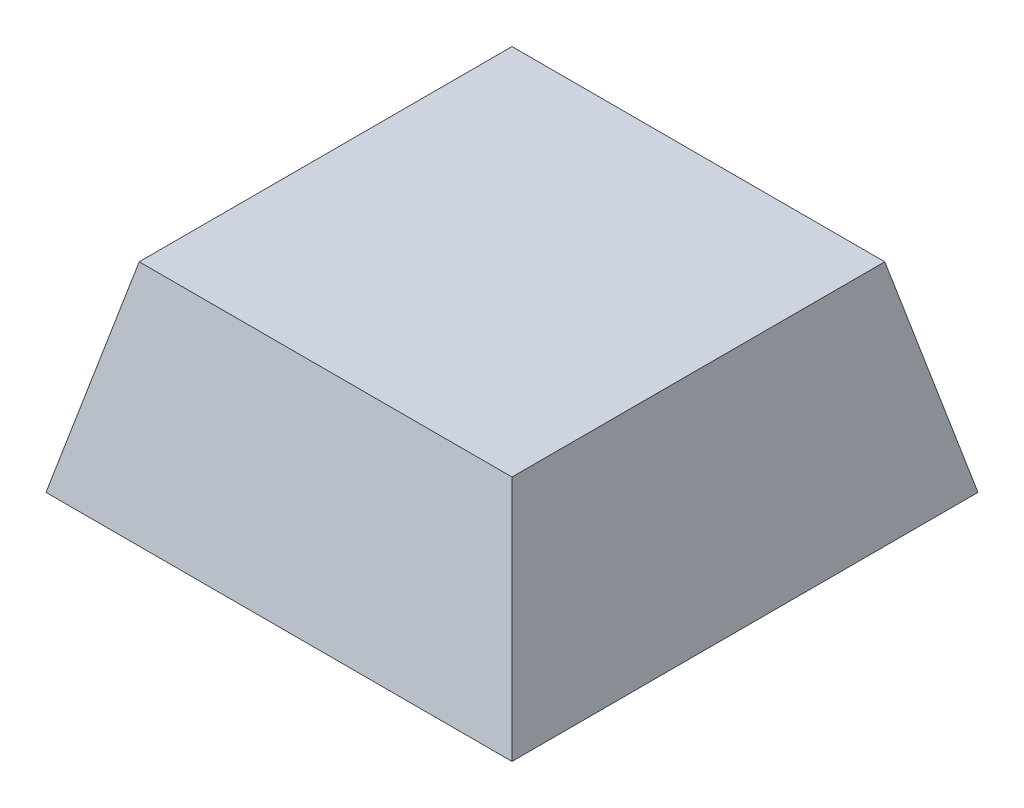
ISO-10303-21;
HEADER;
FILE_DESCRIPTION(('STEP AP214'),'2;1');
FILE_NAME('part.step','',(''),(''),'','','');
FILE_SCHEMA(('AUTOMOTIVE_DESIGN { 1 0 10303 214 1 1 1 1 }'));
ENDSEC;
DATA;
#1=APPLICATION_CONTEXT('core data for automotive mechanical design processes');
#2=APPLICATION_PROTOCOL_DEFINITION('international standard','automotive_design',2000,#1);
#3=PRODUCT_CONTEXT('',#1,'mechanical');
#4=PRODUCT('Part','Part','',(#3));
#5=PRODUCT_RELATED_PRODUCT_CATEGORY('part','',(#4));
#6=PRODUCT_DEFINITION_FORMATION('','',#4);
#7=PRODUCT_DEFINITION_CONTEXT('part definition',#1,'design');
#8=PRODUCT_DEFINITION('design','',#6,#7);
#9=PRODUCT_DEFINITION_SHAPE('','',#8);
#10=(LENGTH_UNIT() NAMED_UNIT(*) SI_UNIT(.MILLI.,.METRE.));
#11=(NAMED_UNIT(*) PLANE_ANGLE_UNIT() SI_UNIT($,.RADIAN.));
#12=(NAMED_UNIT(*) SI_UNIT($,.STERADIAN.) SOLID_ANGLE_UNIT());
#13=UNCERTAINTY_MEASURE_WITH_UNIT(LENGTH_MEASURE(1.E-05),#10,'distance_accuracy_value','');
#14=(GEOMETRIC_REPRESENTATION_CONTEXT(3) GLOBAL_UNCERTAINTY_ASSIGNED_CONTEXT((#13)) GLOBAL_UNIT_ASSIGNED_CONTEXT((#10,
#11,#12)) REPRESENTATION_CONTEXT('',''));
#15=CARTESIAN_POINT('',(0.,0.,0.));
#16=DIRECTION('',(0.,0.,1.));
#17=DIRECTION('',(1.,0.,0.));
#18=AXIS2_PLACEMENT_3D('',#15,#16,#17);
#19=CARTESIAN_POINT('',(0.,3.,0.));
#20=DIRECTION('',(0.,-1.,0.));
#21=DIRECTION('',(0.,0.,-1.));
#22=AXIS2_PLACEMENT_3D('',#19,#20,#21);
#23=PLANE('',#22);
#24=DIRECTION('',(-1.,0.,0.));
#25=VECTOR('',#24,1.);
#26=CARTESIAN_POINT('',(11.,3.,-0.7));
#27=LINE('',#26,#25);
#28=CARTESIAN_POINT('',(6.3,3.,-0.7));
#29=VERTEX_POINT('',#28);
#30=CARTESIAN_POINT('',(0.7,3.,-0.7));
#31=VERTEX_POINT('',#30);
#32=EDGE_CURVE('E57',#29,#31,#27,.T.);
#33=ORIENTED_EDGE('',*,*,#32,.F.);
#34=DIRECTION('',(0.,0.,1.));
#35=VECTOR('',#34,1.);
#36=CARTESIAN_POINT('',(6.3,3.,-7.));
#37=LINE('',#36,#35);
#38=CARTESIAN_POINT('',(6.3,3.,-6.3));
#39=VERTEX_POINT('',#38);
#40=EDGE_CURVE('E113',#39,#29,#37,.T.);
#41=ORIENTED_EDGE('',*,*,#40,.F.);
#42=DIRECTION('',(-1.,0.,0.));
#43=VECTOR('',#42,1.);
#44=CARTESIAN_POINT('',(11.,3.,-6.3));
#45=LINE('',#44,#43);
#46=CARTESIAN_POINT('',(0.699999999999998,3.,-6.3));
#47=VERTEX_POINT('',#46);
#48=EDGE_CURVE('E108',#39,#47,#45,.T.);
#49=ORIENTED_EDGE('',*,*,#48,.T.);
#50=DIRECTION('',(0.,0.,1.));
#51=VECTOR('',#50,1.);
#52=CARTESIAN_POINT('',(0.7,3.,-7.));
#53=LINE('',#52,#51);
#54=EDGE_CURVE('E93',#47,#31,#53,.T.);
#55=ORIENTED_EDGE('',*,*,#54,.T.);
#56=EDGE_LOOP('',(#33,#41,#49,#55));
#57=FACE_BOUND('',#56,.T.);
#58=ADVANCED_FACE('F42',(#57),#23,.F.);
#59=CARTESIAN_POINT('',(7.,0.,-7.));
#60=DIRECTION('',(-0.973841209741793,-0.227229615606418,0.));
#61=DIRECTION('',(0.227229615606418,-0.973841209741793,0.));
#62=AXIS2_PLACEMENT_3D('',#59,#60,#61);
#63=PLANE('',#62);
#64=DIRECTION('',(-0.221581128241521,0.949633406749377,-0.221581128241521));
#65=VECTOR('',#64,1.);
#66=CARTESIAN_POINT('',(6.6563126252505,1.47294589178357,-0.343687374749499));
#67=LINE('',#66,#65);
#68=CARTESIAN_POINT('',(7.,0.,0.));
#69=VERTEX_POINT('',#68);
#70=EDGE_CURVE('E120',#69,#29,#67,.T.);
#71=ORIENTED_EDGE('',*,*,#70,.F.);
#72=DIRECTION('',(0.,0.,-1.));
#73=VECTOR('',#72,1.);
#74=CARTESIAN_POINT('',(7.,0.,0.));
#75=LINE('',#74,#73);
#76=CARTESIAN_POINT('',(7.,0.,-7.));
#77=VERTEX_POINT('',#76);
#78=EDGE_CURVE('E97',#69,#77,#75,.T.);
#79=ORIENTED_EDGE('',*,*,#78,.T.);
#80=DIRECTION('',(0.221581128241521,-0.949633406749377,-0.221581128241521));
#81=VECTOR('',#80,1.);
#82=CARTESIAN_POINT('',(7.,0.,-7.));
#83=LINE('',#82,#81);
#84=EDGE_CURVE('E124',#39,#77,#83,.T.);
#85=ORIENTED_EDGE('',*,*,#84,.F.);
#86=ORIENTED_EDGE('',*,*,#40,.T.);
#87=EDGE_LOOP('',(#71,#79,#85,#86));
#88=FACE_BOUND('',#87,.T.);
#89=ADVANCED_FACE('F151',(#88),#63,.F.);
#90=CARTESIAN_POINT('',(0.,0.,-7.));
#91=DIRECTION('',(0.973841209741793,-0.227229615606418,0.));
#92=DIRECTION('',(0.227229615606418,0.973841209741793,0.));
#93=AXIS2_PLACEMENT_3D('',#90,#91,#92);
#94=PLANE('',#93);
#95=DIRECTION('',(-0.221581128241521,-0.949633406749378,0.221581128241521));
#96=VECTOR('',#95,1.);
#97=CARTESIAN_POINT('',(0.343687374749499,1.47294589178357,-0.3436873747495));
#98=LINE('',#97,#96);
#99=CARTESIAN_POINT('',(0.,0.,0.));
#100=VERTEX_POINT('',#99);
#101=EDGE_CURVE('E11',#31,#100,#98,.T.);
#102=ORIENTED_EDGE('',*,*,#101,.F.);
#103=ORIENTED_EDGE('',*,*,#54,.F.);
#104=DIRECTION('',(0.221581128241521,0.949633406749377,0.221581128241521));
#105=VECTOR('',#104,1.);
#106=CARTESIAN_POINT('',(0.,0.,-7.));
#107=LINE('',#106,#105);
#108=CARTESIAN_POINT('',(0.,0.,-7.));
#109=VERTEX_POINT('',#108);
#110=EDGE_CURVE('E51',#109,#47,#107,.T.);
#111=ORIENTED_EDGE('',*,*,#110,.F.);
#112=DIRECTION('',(0.,0.,1.));
#113=VECTOR('',#112,1.);
#114=CARTESIAN_POINT('',(0.,0.,0.));
#115=LINE('',#114,#113);
#116=EDGE_CURVE('E89',#109,#100,#115,.T.);
#117=ORIENTED_EDGE('',*,*,#116,.T.);
#118=EDGE_LOOP('',(#102,#103,#111,#117));
#119=FACE_BOUND('',#118,.T.);
#120=ADVANCED_FACE('F90',(#119),#94,.F.);
#121=CARTESIAN_POINT('',(0.,0.,0.));
#122=DIRECTION('',(0.,-1.,0.));
#123=DIRECTION('',(0.,0.,-1.));
#124=AXIS2_PLACEMENT_3D('',#121,#122,#123);
#125=PLANE('',#124);
#126=CARTESIAN_POINT('',(3.5,0.,-3.5));
#127=DIRECTION('',(0.,-1.,0.));
#128=DIRECTION('',(0.,0.,-1.));
#129=AXIS2_PLACEMENT_3D('',#126,#127,#128);
#130=CIRCLE('',#129,1.8);
#131=CARTESIAN_POINT('',(3.5,0.,-5.3));
#132=VERTEX_POINT('',#131);
#133=EDGE_CURVE('E129',#132,#132,#130,.T.);
#134=ORIENTED_EDGE('',*,*,#133,.F.);
#135=EDGE_LOOP('',(#134));
#136=FACE_BOUND('',#135,.T.);
#137=ORIENTED_EDGE('',*,*,#116,.F.);
#138=DIRECTION('',(-1.,0.,0.));
#139=VECTOR('',#138,1.);
#140=CARTESIAN_POINT('',(0.,0.,-7.));
#141=LINE('',#140,#139);
#142=EDGE_CURVE('E65',#77,#109,#141,.T.);
#143=ORIENTED_EDGE('',*,*,#142,.F.);
#144=ORIENTED_EDGE('',*,*,#78,.F.);
#145=DIRECTION('',(1.,0.,0.));
#146=VECTOR('',#145,1.);
#147=CARTESIAN_POINT('',(0.,0.,0.));
#148=LINE('',#147,#146);
#149=EDGE_CURVE('E83',#100,#69,#148,.T.);
#150=ORIENTED_EDGE('',*,*,#149,.F.);
#151=EDGE_LOOP('',(#137,#143,#144,#150));
#152=FACE_BOUND('',#151,.T.);
#153=ADVANCED_FACE('F44',(#136,#152),#125,.T.);
#154=CARTESIAN_POINT('',(11.,3.,-6.3));
#155=DIRECTION('',(0.,0.227229615606418,-0.973841209741793));
#156=DIRECTION('',(0.,0.973841209741793,0.227229615606418));
#157=AXIS2_PLACEMENT_3D('',#154,#155,#156);
#158=PLANE('',#157);
#159=ORIENTED_EDGE('',*,*,#84,.T.);
#160=ORIENTED_EDGE('',*,*,#142,.T.);
#161=ORIENTED_EDGE('',*,*,#110,.T.);
#162=ORIENTED_EDGE('',*,*,#48,.F.);
#163=EDGE_LOOP('',(#159,#160,#161,#162));
#164=FACE_BOUND('',#163,.T.);
#165=ADVANCED_FACE('F107',(#164),#158,.T.);
#166=CARTESIAN_POINT('',(11.,0.,0.));
#167=DIRECTION('',(0.,0.227229615606418,0.973841209741793));
#168=DIRECTION('',(0.,-0.973841209741793,0.227229615606418));
#169=AXIS2_PLACEMENT_3D('',#166,#167,#168);
#170=PLANE('',#169);
#171=ORIENTED_EDGE('',*,*,#70,.T.);
#172=ORIENTED_EDGE('',*,*,#32,.T.);
#173=ORIENTED_EDGE('',*,*,#101,.T.);
#174=ORIENTED_EDGE('',*,*,#149,.T.);
#175=EDGE_LOOP('',(#171,#172,#173,#174));
#176=FACE_BOUND('',#175,.T.);
#177=ADVANCED_FACE('F81',(#176),#170,.T.);
#178=CARTESIAN_POINT('',(3.5,0.8,-3.5));
#179=DIRECTION('',(0.,-1.,0.));
#180=DIRECTION('',(0.,0.,-1.));
#181=AXIS2_PLACEMENT_3D('',#178,#179,#180);
#182=CYLINDRICAL_SURFACE('',#181,1.8);
#183=CARTESIAN_POINT('',(3.5,0.8,-3.5));
#184=DIRECTION('',(0.,-1.,0.));
#185=DIRECTION('',(0.,0.,-1.));
#186=AXIS2_PLACEMENT_3D('',#183,#184,#185);
#187=CIRCLE('',#186,1.8);
#188=CARTESIAN_POINT('',(3.5,0.8,-5.3));
#189=VERTEX_POINT('',#188);
#190=EDGE_CURVE('E115',#189,#189,#187,.T.);
#191=ORIENTED_EDGE('',*,*,#190,.F.);
#192=EDGE_LOOP('',(#191));
#193=FACE_BOUND('',#192,.T.);
#194=ORIENTED_EDGE('',*,*,#133,.T.);
#195=EDGE_LOOP('',(#194));
#196=FACE_BOUND('',#195,.T.);
#197=ADVANCED_FACE('F139',(#193,#196),#182,.F.);
#198=CARTESIAN_POINT('',(3.5,0.8,-3.5));
#199=DIRECTION('',(0.,-1.,0.));
#200=DIRECTION('',(0.,0.,-1.));
#201=AXIS2_PLACEMENT_3D('',#198,#199,#200);
#202=PLANE('',#201);
#203=ORIENTED_EDGE('',*,*,#190,.T.);
#204=EDGE_LOOP('',(#203));
#205=FACE_BOUND('',#204,.T.);
#206=ADVANCED_FACE('F137',(#205),#202,.T.);
#207=CLOSED_SHELL('',(#58,#89,#120,#153,#165,#177,#197,#206));
#208=MANIFOLD_SOLID_BREP('B2',#207);
#209=ADVANCED_BREP_SHAPE_REPRESENTATION('',(#18,#208),#14);
#210=SHAPE_DEFINITION_REPRESENTATION(#9,#209);
ENDSEC;
END-ISO-10303-21;
